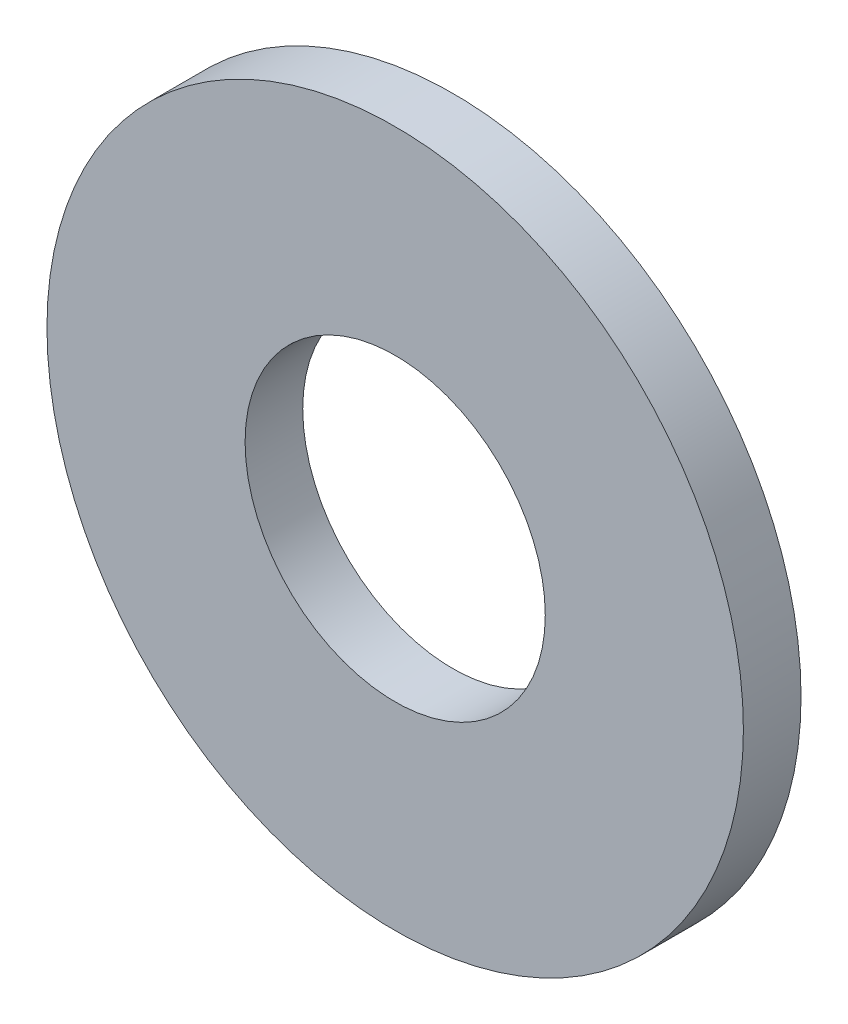
ISO-10303-21;
HEADER;
FILE_DESCRIPTION(('STEP AP214'),'2;1');
FILE_NAME('part.step','',(''),(''),'','','');
FILE_SCHEMA(('AUTOMOTIVE_DESIGN { 1 0 10303 214 1 1 1 1 }'));
ENDSEC;
DATA;
#1=APPLICATION_CONTEXT('core data for automotive mechanical design processes');
#2=APPLICATION_PROTOCOL_DEFINITION('international standard','automotive_design',2000,#1);
#3=PRODUCT_CONTEXT('',#1,'mechanical');
#4=PRODUCT('Part','Part','',(#3));
#5=PRODUCT_RELATED_PRODUCT_CATEGORY('part','',(#4));
#6=PRODUCT_DEFINITION_FORMATION('','',#4);
#7=PRODUCT_DEFINITION_CONTEXT('part definition',#1,'design');
#8=PRODUCT_DEFINITION('design','',#6,#7);
#9=PRODUCT_DEFINITION_SHAPE('','',#8);
#10=(LENGTH_UNIT() NAMED_UNIT(*) SI_UNIT(.MILLI.,.METRE.));
#11=(NAMED_UNIT(*) PLANE_ANGLE_UNIT() SI_UNIT($,.RADIAN.));
#12=(NAMED_UNIT(*) SI_UNIT($,.STERADIAN.) SOLID_ANGLE_UNIT());
#13=UNCERTAINTY_MEASURE_WITH_UNIT(LENGTH_MEASURE(1.E-05),#10,'distance_accuracy_value','');
#14=(GEOMETRIC_REPRESENTATION_CONTEXT(3) GLOBAL_UNCERTAINTY_ASSIGNED_CONTEXT((#13)) GLOBAL_UNIT_ASSIGNED_CONTEXT((#10,
#11,#12)) REPRESENTATION_CONTEXT('',''));
#15=CARTESIAN_POINT('',(0.,0.,0.));
#16=DIRECTION('',(0.,0.,1.));
#17=DIRECTION('',(1.,0.,0.));
#18=AXIS2_PLACEMENT_3D('',#15,#16,#17);
#19=CARTESIAN_POINT('',(0.,0.,2.4));
#20=DIRECTION('',(0.,0.,1.));
#21=DIRECTION('',(1.,0.,0.));
#22=AXIS2_PLACEMENT_3D('',#19,#20,#21);
#23=PLANE('',#22);
#24=CARTESIAN_POINT('',(0.,0.,2.4));
#25=DIRECTION('',(0.,0.,1.));
#26=DIRECTION('',(1.,0.,0.));
#27=AXIS2_PLACEMENT_3D('',#24,#25,#26);
#28=CIRCLE('',#27,14.5);
#29=CARTESIAN_POINT('',(14.5,0.,2.4));
#30=VERTEX_POINT('',#29);
#31=EDGE_CURVE('E10',#30,#30,#28,.T.);
#32=ORIENTED_EDGE('',*,*,#31,.T.);
#33=EDGE_LOOP('',(#32));
#34=FACE_BOUND('',#33,.T.);
#35=CARTESIAN_POINT('',(0.,0.,2.4));
#36=DIRECTION('',(0.,0.,1.));
#37=DIRECTION('',(1.,0.,0.));
#38=AXIS2_PLACEMENT_3D('',#35,#36,#37);
#39=CIRCLE('',#38,6.25);
#40=CARTESIAN_POINT('',(6.25,0.,2.4));
#41=VERTEX_POINT('',#40);
#42=EDGE_CURVE('E45',#41,#41,#39,.T.);
#43=ORIENTED_EDGE('',*,*,#42,.F.);
#44=EDGE_LOOP('',(#43));
#45=FACE_BOUND('',#44,.T.);
#46=ADVANCED_FACE('F34',(#34,#45),#23,.T.);
#47=CARTESIAN_POINT('',(0.,0.,0.));
#48=DIRECTION('',(0.,0.,1.));
#49=DIRECTION('',(1.,0.,0.));
#50=AXIS2_PLACEMENT_3D('',#47,#48,#49);
#51=PLANE('',#50);
#52=CARTESIAN_POINT('',(0.,0.,0.));
#53=DIRECTION('',(0.,0.,1.));
#54=DIRECTION('',(1.,0.,0.));
#55=AXIS2_PLACEMENT_3D('',#52,#53,#54);
#56=CIRCLE('',#55,14.5);
#57=CARTESIAN_POINT('',(14.5,0.,0.));
#58=VERTEX_POINT('',#57);
#59=EDGE_CURVE('E38',#58,#58,#56,.T.);
#60=ORIENTED_EDGE('',*,*,#59,.F.);
#61=EDGE_LOOP('',(#60));
#62=FACE_BOUND('',#61,.T.);
#63=CARTESIAN_POINT('',(0.,0.,0.));
#64=DIRECTION('',(0.,0.,1.));
#65=DIRECTION('',(1.,0.,0.));
#66=AXIS2_PLACEMENT_3D('',#63,#64,#65);
#67=CIRCLE('',#66,6.25);
#68=CARTESIAN_POINT('',(6.25,0.,0.));
#69=VERTEX_POINT('',#68);
#70=EDGE_CURVE('E47',#69,#69,#67,.T.);
#71=ORIENTED_EDGE('',*,*,#70,.T.);
#72=EDGE_LOOP('',(#71));
#73=FACE_BOUND('',#72,.T.);
#74=ADVANCED_FACE('F57',(#62,#73),#51,.F.);
#75=CARTESIAN_POINT('',(0.,0.,2.4));
#76=DIRECTION('',(0.,0.,-1.));
#77=DIRECTION('',(-1.,0.,0.));
#78=AXIS2_PLACEMENT_3D('',#75,#76,#77);
#79=CYLINDRICAL_SURFACE('',#78,14.5);
#80=ORIENTED_EDGE('',*,*,#31,.F.);
#81=EDGE_LOOP('',(#80));
#82=FACE_BOUND('',#81,.T.);
#83=ORIENTED_EDGE('',*,*,#59,.T.);
#84=EDGE_LOOP('',(#83));
#85=FACE_BOUND('',#84,.T.);
#86=ADVANCED_FACE('F36',(#82,#85),#79,.T.);
#87=CARTESIAN_POINT('',(0.,0.,2.4));
#88=DIRECTION('',(0.,0.,-1.));
#89=DIRECTION('',(-1.,0.,0.));
#90=AXIS2_PLACEMENT_3D('',#87,#88,#89);
#91=CYLINDRICAL_SURFACE('',#90,6.25);
#92=ORIENTED_EDGE('',*,*,#42,.T.);
#93=EDGE_LOOP('',(#92));
#94=FACE_BOUND('',#93,.T.);
#95=ORIENTED_EDGE('',*,*,#70,.F.);
#96=EDGE_LOOP('',(#95));
#97=FACE_BOUND('',#96,.T.);
#98=ADVANCED_FACE('F53',(#94,#97),#91,.F.);
#99=CLOSED_SHELL('',(#46,#74,#86,#98));
#100=MANIFOLD_SOLID_BREP('B2',#99);
#101=ADVANCED_BREP_SHAPE_REPRESENTATION('',(#18,#100),#14);
#102=SHAPE_DEFINITION_REPRESENTATION(#9,#101);
ENDSEC;
END-ISO-10303-21;
